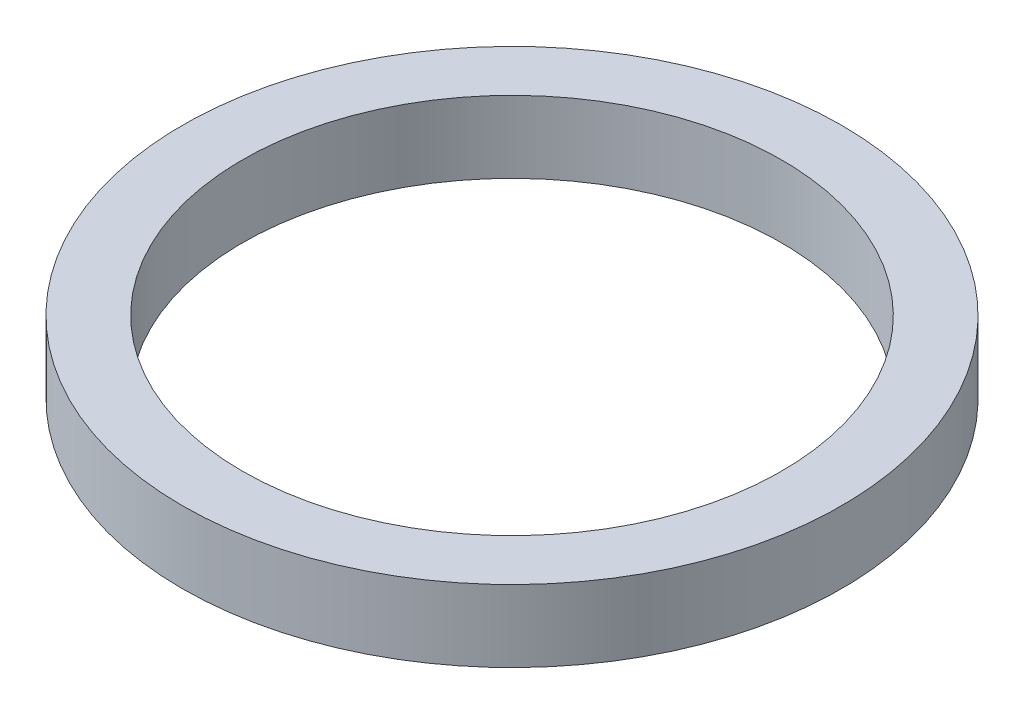
ISO-10303-21;
HEADER;
FILE_DESCRIPTION(('STEP AP214'),'2;1');
FILE_NAME('part.step','',(''),(''),'','','');
FILE_SCHEMA(('AUTOMOTIVE_DESIGN { 1 0 10303 214 1 1 1 1 }'));
ENDSEC;
DATA;
#1=APPLICATION_CONTEXT('core data for automotive mechanical design processes');
#2=APPLICATION_PROTOCOL_DEFINITION('international standard','automotive_design',2000,#1);
#3=PRODUCT_CONTEXT('',#1,'mechanical');
#4=PRODUCT('Part','Part','',(#3));
#5=PRODUCT_RELATED_PRODUCT_CATEGORY('part','',(#4));
#6=PRODUCT_DEFINITION_FORMATION('','',#4);
#7=PRODUCT_DEFINITION_CONTEXT('part definition',#1,'design');
#8=PRODUCT_DEFINITION('design','',#6,#7);
#9=PRODUCT_DEFINITION_SHAPE('','',#8);
#10=(LENGTH_UNIT() NAMED_UNIT(*) SI_UNIT(.MILLI.,.METRE.));
#11=(NAMED_UNIT(*) PLANE_ANGLE_UNIT() SI_UNIT($,.RADIAN.));
#12=(NAMED_UNIT(*) SI_UNIT($,.STERADIAN.) SOLID_ANGLE_UNIT());
#13=UNCERTAINTY_MEASURE_WITH_UNIT(LENGTH_MEASURE(1.E-05),#10,'distance_accuracy_value','');
#14=(GEOMETRIC_REPRESENTATION_CONTEXT(3) GLOBAL_UNCERTAINTY_ASSIGNED_CONTEXT((#13)) GLOBAL_UNIT_ASSIGNED_CONTEXT((#10,
#11,#12)) REPRESENTATION_CONTEXT('',''));
#15=CARTESIAN_POINT('',(0.,0.,0.));
#16=DIRECTION('',(0.,0.,1.));
#17=DIRECTION('',(1.,0.,0.));
#18=AXIS2_PLACEMENT_3D('',#15,#16,#17);
#19=CARTESIAN_POINT('',(0.,6.,0.));
#20=DIRECTION('',(0.,1.,0.));
#21=DIRECTION('',(0.,0.,1.));
#22=AXIS2_PLACEMENT_3D('',#19,#20,#21);
#23=PLANE('',#22);
#24=CARTESIAN_POINT('',(0.,6.,0.));
#25=DIRECTION('',(0.,1.,0.));
#26=DIRECTION('',(0.,0.,1.));
#27=AXIS2_PLACEMENT_3D('',#24,#25,#26);
#28=CIRCLE('',#27,27.5);
#29=CARTESIAN_POINT('',(0.,6.,27.5));
#30=VERTEX_POINT('',#29);
#31=EDGE_CURVE('E8',#30,#30,#28,.T.);
#32=ORIENTED_EDGE('',*,*,#31,.T.);
#33=EDGE_LOOP('',(#32));
#34=FACE_BOUND('',#33,.T.);
#35=CARTESIAN_POINT('',(0.,6.,0.));
#36=DIRECTION('',(0.,1.,0.));
#37=DIRECTION('',(0.,0.,1.));
#38=AXIS2_PLACEMENT_3D('',#35,#36,#37);
#39=CIRCLE('',#38,22.5);
#40=CARTESIAN_POINT('',(0.,6.,22.5));
#41=VERTEX_POINT('',#40);
#42=EDGE_CURVE('E27',#41,#41,#39,.T.);
#43=ORIENTED_EDGE('',*,*,#42,.F.);
#44=EDGE_LOOP('',(#43));
#45=FACE_BOUND('',#44,.T.);
#46=ADVANCED_FACE('F13',(#34,#45),#23,.T.);
#47=CARTESIAN_POINT('',(0.,0.,0.));
#48=DIRECTION('',(0.,1.,0.));
#49=DIRECTION('',(0.,0.,1.));
#50=AXIS2_PLACEMENT_3D('',#47,#48,#49);
#51=PLANE('',#50);
#52=CARTESIAN_POINT('',(0.,0.,0.));
#53=DIRECTION('',(0.,1.,0.));
#54=DIRECTION('',(0.,0.,1.));
#55=AXIS2_PLACEMENT_3D('',#52,#53,#54);
#56=CIRCLE('',#55,27.5);
#57=CARTESIAN_POINT('',(0.,0.,27.5));
#58=VERTEX_POINT('',#57);
#59=EDGE_CURVE('E17',#58,#58,#56,.T.);
#60=ORIENTED_EDGE('',*,*,#59,.F.);
#61=EDGE_LOOP('',(#60));
#62=FACE_BOUND('',#61,.T.);
#63=CARTESIAN_POINT('',(0.,0.,0.));
#64=DIRECTION('',(0.,1.,0.));
#65=DIRECTION('',(0.,0.,1.));
#66=AXIS2_PLACEMENT_3D('',#63,#64,#65);
#67=CIRCLE('',#66,22.5);
#68=CARTESIAN_POINT('',(0.,0.,22.5));
#69=VERTEX_POINT('',#68);
#70=EDGE_CURVE('E29',#69,#69,#67,.T.);
#71=ORIENTED_EDGE('',*,*,#70,.T.);
#72=EDGE_LOOP('',(#71));
#73=FACE_BOUND('',#72,.T.);
#74=ADVANCED_FACE('F41',(#62,#73),#51,.F.);
#75=CARTESIAN_POINT('',(0.,6.,0.));
#76=DIRECTION('',(0.,-1.,0.));
#77=DIRECTION('',(0.,0.,-1.));
#78=AXIS2_PLACEMENT_3D('',#75,#76,#77);
#79=CYLINDRICAL_SURFACE('',#78,27.5);
#80=ORIENTED_EDGE('',*,*,#31,.F.);
#81=EDGE_LOOP('',(#80));
#82=FACE_BOUND('',#81,.T.);
#83=ORIENTED_EDGE('',*,*,#59,.T.);
#84=EDGE_LOOP('',(#83));
#85=FACE_BOUND('',#84,.T.);
#86=ADVANCED_FACE('F15',(#82,#85),#79,.T.);
#87=CARTESIAN_POINT('',(0.,6.,0.));
#88=DIRECTION('',(0.,-1.,0.));
#89=DIRECTION('',(0.,0.,-1.));
#90=AXIS2_PLACEMENT_3D('',#87,#88,#89);
#91=CYLINDRICAL_SURFACE('',#90,22.5);
#92=ORIENTED_EDGE('',*,*,#42,.T.);
#93=EDGE_LOOP('',(#92));
#94=FACE_BOUND('',#93,.T.);
#95=ORIENTED_EDGE('',*,*,#70,.F.);
#96=EDGE_LOOP('',(#95));
#97=FACE_BOUND('',#96,.T.);
#98=ADVANCED_FACE('F37',(#94,#97),#91,.F.);
#99=CLOSED_SHELL('',(#46,#74,#86,#98));
#100=MANIFOLD_SOLID_BREP('B1',#99);
#101=ADVANCED_BREP_SHAPE_REPRESENTATION('',(#18,#100),#14);
#102=SHAPE_DEFINITION_REPRESENTATION(#9,#101);
ENDSEC;
END-ISO-10303-21;
